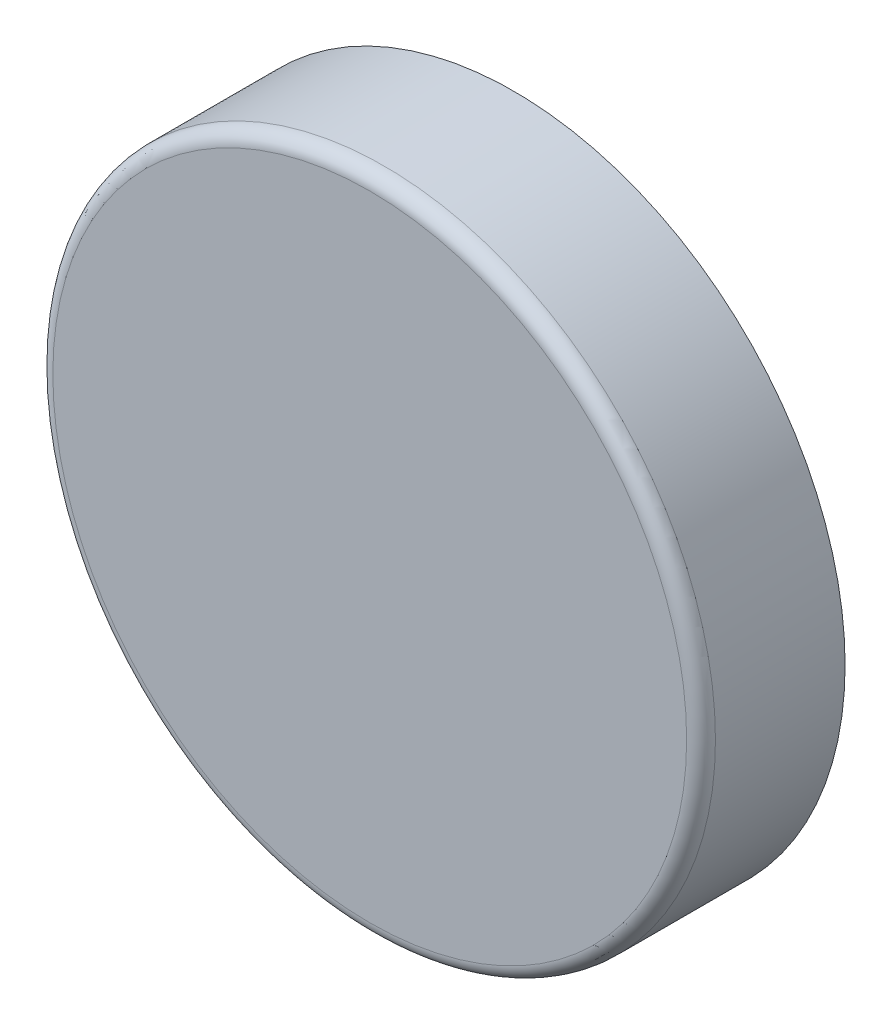
ISO-10303-21;
HEADER;
FILE_DESCRIPTION(('STEP AP214'),'2;1');
FILE_NAME('part.step','',(''),(''),'','','');
FILE_SCHEMA(('AUTOMOTIVE_DESIGN { 1 0 10303 214 1 1 1 1 }'));
ENDSEC;
DATA;
#1=APPLICATION_CONTEXT('core data for automotive mechanical design processes');
#2=APPLICATION_PROTOCOL_DEFINITION('international standard','automotive_design',2000,#1);
#3=PRODUCT_CONTEXT('',#1,'mechanical');
#4=PRODUCT('Part','Part','',(#3));
#5=PRODUCT_RELATED_PRODUCT_CATEGORY('part','',(#4));
#6=PRODUCT_DEFINITION_FORMATION('','',#4);
#7=PRODUCT_DEFINITION_CONTEXT('part definition',#1,'design');
#8=PRODUCT_DEFINITION('design','',#6,#7);
#9=PRODUCT_DEFINITION_SHAPE('','',#8);
#10=(LENGTH_UNIT() NAMED_UNIT(*) SI_UNIT(.MILLI.,.METRE.));
#11=(NAMED_UNIT(*) PLANE_ANGLE_UNIT() SI_UNIT($,.RADIAN.));
#12=(NAMED_UNIT(*) SI_UNIT($,.STERADIAN.) SOLID_ANGLE_UNIT());
#13=UNCERTAINTY_MEASURE_WITH_UNIT(LENGTH_MEASURE(1.E-05),#10,'distance_accuracy_value','');
#14=(GEOMETRIC_REPRESENTATION_CONTEXT(3) GLOBAL_UNCERTAINTY_ASSIGNED_CONTEXT((#13)) GLOBAL_UNIT_ASSIGNED_CONTEXT((#10,
#11,#12)) REPRESENTATION_CONTEXT('',''));
#15=CARTESIAN_POINT('',(0.,0.,0.));
#16=DIRECTION('',(0.,0.,1.));
#17=DIRECTION('',(1.,0.,0.));
#18=AXIS2_PLACEMENT_3D('',#15,#16,#17);
#19=CARTESIAN_POINT('',(-0.55,0.,4.9));
#20=DIRECTION('',(0.,0.,-1.));
#21=DIRECTION('',(-1.,0.,0.));
#22=AXIS2_PLACEMENT_3D('',#19,#20,#21);
#23=TOROIDAL_SURFACE('',#22,2.2,0.0999999999999997);
#24=CARTESIAN_POINT('',(-0.55,0.,5.));
#25=DIRECTION('',(0.,0.,-1.));
#26=DIRECTION('',(-1.,0.,0.));
#27=AXIS2_PLACEMENT_3D('',#24,#25,#26);
#28=CIRCLE('',#27,2.2);
#29=CARTESIAN_POINT('',(-2.75,0.,5.));
#30=VERTEX_POINT('',#29);
#31=EDGE_CURVE('E10',#30,#30,#28,.T.);
#32=ORIENTED_EDGE('',*,*,#31,.T.);
#33=EDGE_LOOP('',(#32));
#34=FACE_BOUND('',#33,.T.);
#35=CARTESIAN_POINT('',(-0.55,0.,4.9));
#36=DIRECTION('',(0.,0.,-1.));
#37=DIRECTION('',(-1.,0.,0.));
#38=AXIS2_PLACEMENT_3D('',#35,#36,#37);
#39=CIRCLE('',#38,2.3);
#40=CARTESIAN_POINT('',(-2.85,0.,4.9));
#41=VERTEX_POINT('',#40);
#42=EDGE_CURVE('E42',#41,#41,#39,.T.);
#43=ORIENTED_EDGE('',*,*,#42,.F.);
#44=EDGE_LOOP('',(#43));
#45=FACE_BOUND('',#44,.T.);
#46=ADVANCED_FACE('F32',(#34,#45),#23,.T.);
#47=CARTESIAN_POINT('',(1.65,0.,5.));
#48=DIRECTION('',(0.,0.,1.));
#49=DIRECTION('',(1.,0.,0.));
#50=AXIS2_PLACEMENT_3D('',#47,#48,#49);
#51=PLANE('',#50);
#52=ORIENTED_EDGE('',*,*,#31,.F.);
#53=EDGE_LOOP('',(#52));
#54=FACE_BOUND('',#53,.T.);
#55=ADVANCED_FACE('F53',(#54),#51,.T.);
#56=CARTESIAN_POINT('',(-0.55,0.,4.));
#57=DIRECTION('',(0.,0.,-1.));
#58=DIRECTION('',(-1.,0.,0.));
#59=AXIS2_PLACEMENT_3D('',#56,#57,#58);
#60=PLANE('',#59);
#61=CARTESIAN_POINT('',(-0.55,0.,4.));
#62=DIRECTION('',(0.,0.,-1.));
#63=DIRECTION('',(-1.,0.,0.));
#64=AXIS2_PLACEMENT_3D('',#61,#62,#63);
#65=CIRCLE('',#64,2.3);
#66=CARTESIAN_POINT('',(-2.85,0.,4.));
#67=VERTEX_POINT('',#66);
#68=EDGE_CURVE('E38',#67,#67,#65,.T.);
#69=ORIENTED_EDGE('',*,*,#68,.T.);
#70=EDGE_LOOP('',(#69));
#71=FACE_BOUND('',#70,.T.);
#72=ADVANCED_FACE('F57',(#71),#60,.T.);
#73=CARTESIAN_POINT('',(-0.55,0.,5.));
#74=DIRECTION('',(0.,0.,-1.));
#75=DIRECTION('',(-1.,0.,0.));
#76=AXIS2_PLACEMENT_3D('',#73,#74,#75);
#77=CYLINDRICAL_SURFACE('',#76,2.3);
#78=ORIENTED_EDGE('',*,*,#42,.T.);
#79=EDGE_LOOP('',(#78));
#80=FACE_BOUND('',#79,.T.);
#81=ORIENTED_EDGE('',*,*,#68,.F.);
#82=EDGE_LOOP('',(#81));
#83=FACE_BOUND('',#82,.T.);
#84=ADVANCED_FACE('F49',(#80,#83),#77,.T.);
#85=CLOSED_SHELL('',(#46,#55,#72,#84));
#86=MANIFOLD_SOLID_BREP('B2',#85);
#87=ADVANCED_BREP_SHAPE_REPRESENTATION('',(#18,#86),#14);
#88=SHAPE_DEFINITION_REPRESENTATION(#9,#87);
ENDSEC;
END-ISO-10303-21;
